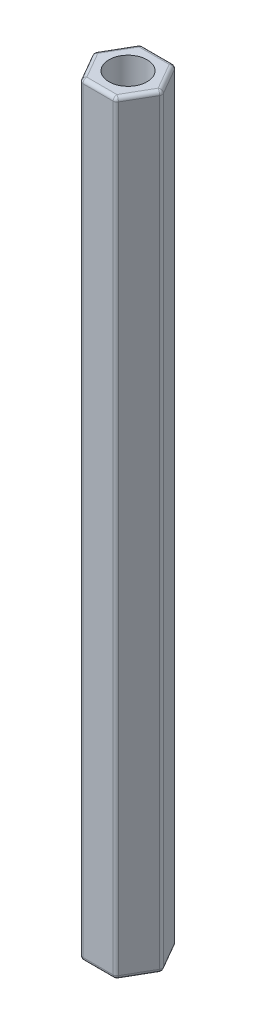
ISO-10303-21;
HEADER;
FILE_DESCRIPTION(('STEP AP214'),'2;1');
FILE_NAME('part.step','',(''),(''),'','','');
FILE_SCHEMA(('AUTOMOTIVE_DESIGN { 1 0 10303 214 1 1 1 1 }'));
ENDSEC;
DATA;
#1=APPLICATION_CONTEXT('core data for automotive mechanical design processes');
#2=APPLICATION_PROTOCOL_DEFINITION('international standard','automotive_design',2000,#1);
#3=PRODUCT_CONTEXT('',#1,'mechanical');
#4=PRODUCT('Part','Part','',(#3));
#5=PRODUCT_RELATED_PRODUCT_CATEGORY('part','',(#4));
#6=PRODUCT_DEFINITION_FORMATION('','',#4);
#7=PRODUCT_DEFINITION_CONTEXT('part definition',#1,'design');
#8=PRODUCT_DEFINITION('design','',#6,#7);
#9=PRODUCT_DEFINITION_SHAPE('','',#8);
#10=(LENGTH_UNIT() NAMED_UNIT(*) SI_UNIT(.MILLI.,.METRE.));
#11=(NAMED_UNIT(*) PLANE_ANGLE_UNIT() SI_UNIT($,.RADIAN.));
#12=(NAMED_UNIT(*) SI_UNIT($,.STERADIAN.) SOLID_ANGLE_UNIT());
#13=UNCERTAINTY_MEASURE_WITH_UNIT(LENGTH_MEASURE(1.E-05),#10,'distance_accuracy_value','');
#14=(GEOMETRIC_REPRESENTATION_CONTEXT(3) GLOBAL_UNCERTAINTY_ASSIGNED_CONTEXT((#13)) GLOBAL_UNIT_ASSIGNED_CONTEXT((#10,
#11,#12)) REPRESENTATION_CONTEXT('',''));
#15=CARTESIAN_POINT('',(0.,0.,0.));
#16=DIRECTION('',(0.,0.,1.));
#17=DIRECTION('',(1.,0.,0.));
#18=AXIS2_PLACEMENT_3D('',#15,#16,#17);
#19=CARTESIAN_POINT('',(0.,60.,0.));
#20=DIRECTION('',(0.,1.,0.));
#21=DIRECTION('',(0.,0.,1.));
#22=AXIS2_PLACEMENT_3D('',#19,#20,#21);
#23=PLANE('',#22);
#24=DIRECTION('',(0.500000000000007,0.,0.866025403784435));
#25=VECTOR('',#24,1.);
#26=CARTESIAN_POINT('',(-1.09696551146027,60.,2.20000000000001));
#27=LINE('',#26,#25);
#28=CARTESIAN_POINT('',(-2.36713610367747,60.,0.));
#29=VERTEX_POINT('',#28);
#30=CARTESIAN_POINT('',(-1.18356805183872,60.,2.05000000000001));
#31=VERTEX_POINT('',#30);
#32=EDGE_CURVE('E254',#29,#31,#27,.T.);
#33=ORIENTED_EDGE('',*,*,#32,.T.);
#34=DIRECTION('',(1.,0.,0.));
#35=VECTOR('',#34,1.);
#36=CARTESIAN_POINT('',(1.35677313259565,60.,2.04999999999999));
#37=LINE('',#36,#35);
#38=CARTESIAN_POINT('',(1.18356805183876,60.,2.04999999999999));
#39=VERTEX_POINT('',#38);
#40=EDGE_CURVE('E256',#31,#39,#37,.T.);
#41=ORIENTED_EDGE('',*,*,#40,.T.);
#42=DIRECTION('',(0.499999999999995,0.,-0.866025403784442));
#43=VECTOR('',#42,1.);
#44=CARTESIAN_POINT('',(2.45373864405591,60.,-0.149999999999999));
#45=LINE('',#44,#43);
#46=CARTESIAN_POINT('',(2.36713610367747,60.,0.));
#47=VERTEX_POINT('',#46);
#48=EDGE_CURVE('E246',#39,#47,#45,.T.);
#49=ORIENTED_EDGE('',*,*,#48,.T.);
#50=DIRECTION('',(-0.500000000000001,0.,-0.866025403784438));
#51=VECTOR('',#50,1.);
#52=CARTESIAN_POINT('',(1.09696551146028,60.,-2.20000000000001));
#53=LINE('',#52,#51);
#54=CARTESIAN_POINT('',(1.18356805183873,60.,-2.05000000000001));
#55=VERTEX_POINT('',#54);
#56=EDGE_CURVE('E248',#47,#55,#53,.T.);
#57=ORIENTED_EDGE('',*,*,#56,.T.);
#58=DIRECTION('',(-1.,0.,0.));
#59=VECTOR('',#58,1.);
#60=CARTESIAN_POINT('',(-1.35677313259563,60.,-2.05));
#61=LINE('',#60,#59);
#62=CARTESIAN_POINT('',(-1.18356805183874,60.,-2.05));
#63=VERTEX_POINT('',#62);
#64=EDGE_CURVE('E250',#55,#63,#61,.T.);
#65=ORIENTED_EDGE('',*,*,#64,.T.);
#66=DIRECTION('',(-0.499999999999995,0.,0.866025403784442));
#67=VECTOR('',#66,1.);
#68=CARTESIAN_POINT('',(-2.45373864405591,60.,0.150000000000018));
#69=LINE('',#68,#67);
#70=EDGE_CURVE('E252',#63,#29,#69,.T.);
#71=ORIENTED_EDGE('',*,*,#70,.T.);
#72=EDGE_LOOP('',(#33,#41,#49,#57,#65,#71));
#73=FACE_BOUND('',#72,.T.);
#74=CARTESIAN_POINT('',(0.,60.,0.));
#75=DIRECTION('',(0.,1.,0.));
#76=DIRECTION('',(0.,0.,1.));
#77=AXIS2_PLACEMENT_3D('',#74,#75,#76);
#78=CIRCLE('',#77,1.5);
#79=CARTESIAN_POINT('',(0.,60.,1.5));
#80=VERTEX_POINT('',#79);
#81=EDGE_CURVE('E193',#80,#80,#78,.T.);
#82=ORIENTED_EDGE('',*,*,#81,.F.);
#83=EDGE_LOOP('',(#82));
#84=FACE_BOUND('',#83,.T.);
#85=ADVANCED_FACE('F36',(#73,#84),#23,.T.);
#86=CARTESIAN_POINT('',(0.,0.,0.));
#87=DIRECTION('',(0.,1.,0.));
#88=DIRECTION('',(0.,0.,1.));
#89=AXIS2_PLACEMENT_3D('',#86,#87,#88);
#90=PLANE('',#89);
#91=DIRECTION('',(0.499999999999995,0.,-0.866025403784442));
#92=VECTOR('',#91,1.);
#93=CARTESIAN_POINT('',(1.77535207775811,0.,1.02499999999999));
#94=LINE('',#93,#92);
#95=CARTESIAN_POINT('',(2.36713610367747,0.,0.));
#96=VERTEX_POINT('',#95);
#97=CARTESIAN_POINT('',(1.18356805183876,0.,2.04999999999999));
#98=VERTEX_POINT('',#97);
#99=EDGE_CURVE('E259',#96,#98,#94,.F.);
#100=ORIENTED_EDGE('',*,*,#99,.T.);
#101=DIRECTION('',(1.,0.,0.));
#102=VECTOR('',#101,1.);
#103=CARTESIAN_POINT('',(0.,0.,2.05));
#104=LINE('',#103,#102);
#105=CARTESIAN_POINT('',(-1.18356805183872,0.,2.05000000000001));
#106=VERTEX_POINT('',#105);
#107=EDGE_CURVE('E11',#98,#106,#104,.F.);
#108=ORIENTED_EDGE('',*,*,#107,.T.);
#109=DIRECTION('',(0.500000000000007,0.,0.866025403784435));
#110=VECTOR('',#109,1.);
#111=CARTESIAN_POINT('',(-1.77535207775809,0.,1.02500000000001));
#112=LINE('',#111,#110);
#113=CARTESIAN_POINT('',(-2.36713610367747,0.,0.));
#114=VERTEX_POINT('',#113);
#115=EDGE_CURVE('E45',#106,#114,#112,.F.);
#116=ORIENTED_EDGE('',*,*,#115,.T.);
#117=DIRECTION('',(-0.499999999999995,0.,0.866025403784442));
#118=VECTOR('',#117,1.);
#119=CARTESIAN_POINT('',(-1.77535207775811,0.,-1.02499999999999));
#120=LINE('',#119,#118);
#121=CARTESIAN_POINT('',(-1.18356805183874,0.,-2.05));
#122=VERTEX_POINT('',#121);
#123=EDGE_CURVE('E265',#114,#122,#120,.F.);
#124=ORIENTED_EDGE('',*,*,#123,.T.);
#125=DIRECTION('',(-1.,0.,0.));
#126=VECTOR('',#125,1.);
#127=CARTESIAN_POINT('',(0.,0.,-2.05));
#128=LINE('',#127,#126);
#129=CARTESIAN_POINT('',(1.18356805183873,0.,-2.05000000000001));
#130=VERTEX_POINT('',#129);
#131=EDGE_CURVE('E263',#122,#130,#128,.F.);
#132=ORIENTED_EDGE('',*,*,#131,.T.);
#133=DIRECTION('',(-0.500000000000001,0.,-0.866025403784438));
#134=VECTOR('',#133,1.);
#135=CARTESIAN_POINT('',(1.7753520777581,0.,-1.025));
#136=LINE('',#135,#134);
#137=EDGE_CURVE('E261',#130,#96,#136,.F.);
#138=ORIENTED_EDGE('',*,*,#137,.T.);
#139=EDGE_LOOP('',(#100,#108,#116,#124,#132,#138));
#140=FACE_BOUND('',#139,.T.);
#141=CARTESIAN_POINT('',(0.,0.,0.));
#142=DIRECTION('',(0.,1.,0.));
#143=DIRECTION('',(0.,0.,1.));
#144=AXIS2_PLACEMENT_3D('',#141,#142,#143);
#145=CIRCLE('',#144,1.5);
#146=CARTESIAN_POINT('',(0.,0.,1.5));
#147=VERTEX_POINT('',#146);
#148=EDGE_CURVE('E357',#147,#147,#145,.T.);
#149=ORIENTED_EDGE('',*,*,#148,.T.);
#150=EDGE_LOOP('',(#149));
#151=FACE_BOUND('',#150,.T.);
#152=ADVANCED_FACE('F374',(#140,#151),#90,.F.);
#153=CARTESIAN_POINT('',(1.35677313259565,60.,2.34999999999999));
#154=DIRECTION('',(-0.866025403784441,0.,-0.499999999999995));
#155=DIRECTION('',(-0.499999999999995,0.,0.866025403784442));
#156=AXIS2_PLACEMENT_3D('',#153,#154,#155);
#157=PLANE('',#156);
#158=DIRECTION('',(0.,-1.,0.));
#159=VECTOR('',#158,1.);
#160=CARTESIAN_POINT('',(2.6269437248128,60.,0.15));
#161=LINE('',#160,#159);
#162=CARTESIAN_POINT('',(2.6269437248128,0.300000000000002,0.15));
#163=VERTEX_POINT('',#162);
#164=CARTESIAN_POINT('',(2.6269437248128,59.7,0.15));
#165=VERTEX_POINT('',#164);
#166=EDGE_CURVE('E170',#163,#165,#161,.F.);
#167=ORIENTED_EDGE('',*,*,#166,.T.);
#168=DIRECTION('',(0.499999999999995,0.,-0.866025403784442));
#169=VECTOR('',#168,1.);
#170=CARTESIAN_POINT('',(1.35677313259565,59.7,2.34999999999999));
#171=LINE('',#170,#169);
#172=CARTESIAN_POINT('',(1.44337567297409,59.7,2.19999999999999));
#173=VERTEX_POINT('',#172);
#174=EDGE_CURVE('E208',#165,#173,#171,.F.);
#175=ORIENTED_EDGE('',*,*,#174,.T.);
#176=DIRECTION('',(0.,-1.,0.));
#177=VECTOR('',#176,1.);
#178=CARTESIAN_POINT('',(1.44337567297409,60.,2.19999999999999));
#179=LINE('',#178,#177);
#180=CARTESIAN_POINT('',(1.44337567297409,0.300000000000002,2.19999999999999));
#181=VERTEX_POINT('',#180);
#182=EDGE_CURVE('E205',#173,#181,#179,.T.);
#183=ORIENTED_EDGE('',*,*,#182,.T.);
#184=DIRECTION('',(0.499999999999995,0.,-0.866025403784442));
#185=VECTOR('',#184,1.);
#186=CARTESIAN_POINT('',(1.35677313259565,0.300000000000002,2.34999999999999));
#187=LINE('',#186,#185);
#188=EDGE_CURVE('E200',#181,#163,#187,.T.);
#189=ORIENTED_EDGE('',*,*,#188,.T.);
#190=EDGE_LOOP('',(#167,#175,#183,#189));
#191=FACE_BOUND('',#190,.T.);
#192=ADVANCED_FACE('F380',(#191),#157,.F.);
#193=CARTESIAN_POINT('',(2.71354626519124,60.,0.));
#194=DIRECTION('',(-0.866025403784438,0.,0.500000000000001));
#195=DIRECTION('',(0.500000000000001,0.,0.866025403784438));
#196=AXIS2_PLACEMENT_3D('',#193,#194,#195);
#197=PLANE('',#196);
#198=DIRECTION('',(0.,-1.,0.));
#199=VECTOR('',#198,1.);
#200=CARTESIAN_POINT('',(1.44337567297406,60.,-2.20000000000001));
#201=LINE('',#200,#199);
#202=CARTESIAN_POINT('',(1.44337567297406,0.300000000000002,-2.20000000000001));
#203=VERTEX_POINT('',#202);
#204=CARTESIAN_POINT('',(1.44337567297406,59.7,-2.20000000000001));
#205=VERTEX_POINT('',#204);
#206=EDGE_CURVE('E192',#203,#205,#201,.F.);
#207=ORIENTED_EDGE('',*,*,#206,.T.);
#208=DIRECTION('',(-0.500000000000001,0.,-0.866025403784438));
#209=VECTOR('',#208,1.);
#210=CARTESIAN_POINT('',(2.71354626519124,59.7,0.));
#211=LINE('',#210,#209);
#212=CARTESIAN_POINT('',(2.6269437248128,59.7,-0.149999999999999));
#213=VERTEX_POINT('',#212);
#214=EDGE_CURVE('E197',#205,#213,#211,.F.);
#215=ORIENTED_EDGE('',*,*,#214,.T.);
#216=DIRECTION('',(0.,-1.,0.));
#217=VECTOR('',#216,1.);
#218=CARTESIAN_POINT('',(2.6269437248128,60.,-0.149999999999999));
#219=LINE('',#218,#217);
#220=CARTESIAN_POINT('',(2.6269437248128,0.300000000000002,-0.149999999999999));
#221=VERTEX_POINT('',#220);
#222=EDGE_CURVE('E168',#213,#221,#219,.T.);
#223=ORIENTED_EDGE('',*,*,#222,.T.);
#224=DIRECTION('',(-0.500000000000001,0.,-0.866025403784438));
#225=VECTOR('',#224,1.);
#226=CARTESIAN_POINT('',(2.71354626519124,0.300000000000002,0.));
#227=LINE('',#226,#225);
#228=EDGE_CURVE('E186',#221,#203,#227,.T.);
#229=ORIENTED_EDGE('',*,*,#228,.T.);
#230=EDGE_LOOP('',(#207,#215,#223,#229));
#231=FACE_BOUND('',#230,.T.);
#232=ADVANCED_FACE('F195',(#231),#197,.F.);
#233=CARTESIAN_POINT('',(1.35677313259562,60.,-2.35000000000001));
#234=DIRECTION('',(0.,0.,1.));
#235=DIRECTION('',(1.,0.,0.));
#236=AXIS2_PLACEMENT_3D('',#233,#234,#235);
#237=PLANE('',#236);
#238=DIRECTION('',(0.,-1.,0.));
#239=VECTOR('',#238,1.);
#240=CARTESIAN_POINT('',(-1.18356805183874,60.,-2.35));
#241=LINE('',#240,#239);
#242=CARTESIAN_POINT('',(-1.18356805183874,0.300000000000002,-2.35));
#243=VERTEX_POINT('',#242);
#244=CARTESIAN_POINT('',(-1.18356805183874,59.7,-2.35));
#245=VERTEX_POINT('',#244);
#246=EDGE_CURVE('E212',#243,#245,#241,.F.);
#247=ORIENTED_EDGE('',*,*,#246,.T.);
#248=DIRECTION('',(-1.,0.,0.));
#249=VECTOR('',#248,1.);
#250=CARTESIAN_POINT('',(1.35677313259562,59.7,-2.35000000000001));
#251=LINE('',#250,#249);
#252=CARTESIAN_POINT('',(1.18356805183873,59.7,-2.35));
#253=VERTEX_POINT('',#252);
#254=EDGE_CURVE('E217',#245,#253,#251,.F.);
#255=ORIENTED_EDGE('',*,*,#254,.T.);
#256=DIRECTION('',(0.,-1.,0.));
#257=VECTOR('',#256,1.);
#258=CARTESIAN_POINT('',(1.18356805183873,60.,-2.35));
#259=LINE('',#258,#257);
#260=CARTESIAN_POINT('',(1.18356805183873,0.300000000000002,-2.35));
#261=VERTEX_POINT('',#260);
#262=EDGE_CURVE('E214',#253,#261,#259,.T.);
#263=ORIENTED_EDGE('',*,*,#262,.T.);
#264=DIRECTION('',(-1.,0.,0.));
#265=VECTOR('',#264,1.);
#266=CARTESIAN_POINT('',(1.35677313259562,0.300000000000002,-2.35000000000001));
#267=LINE('',#266,#265);
#268=EDGE_CURVE('E210',#261,#243,#267,.T.);
#269=ORIENTED_EDGE('',*,*,#268,.T.);
#270=EDGE_LOOP('',(#247,#255,#263,#269));
#271=FACE_BOUND('',#270,.T.);
#272=ADVANCED_FACE('F395',(#271),#237,.F.);
#273=CARTESIAN_POINT('',(-1.35677313259563,60.,-2.35));
#274=DIRECTION('',(0.866025403784441,0.,0.499999999999995));
#275=DIRECTION('',(0.499999999999995,0.,-0.866025403784442));
#276=AXIS2_PLACEMENT_3D('',#273,#274,#275);
#277=PLANE('',#276);
#278=DIRECTION('',(0.,-1.,0.));
#279=VECTOR('',#278,1.);
#280=CARTESIAN_POINT('',(-2.6269437248128,60.,-0.149999999999982));
#281=LINE('',#280,#279);
#282=CARTESIAN_POINT('',(-2.6269437248128,0.300000000000002,-0.149999999999982));
#283=VERTEX_POINT('',#282);
#284=CARTESIAN_POINT('',(-2.6269437248128,59.7,-0.149999999999982));
#285=VERTEX_POINT('',#284);
#286=EDGE_CURVE('E221',#283,#285,#281,.F.);
#287=ORIENTED_EDGE('',*,*,#286,.T.);
#288=DIRECTION('',(-0.499999999999995,0.,0.866025403784442));
#289=VECTOR('',#288,1.);
#290=CARTESIAN_POINT('',(-1.35677313259563,59.7,-2.35));
#291=LINE('',#290,#289);
#292=CARTESIAN_POINT('',(-1.44337567297408,59.7,-2.19999999999999));
#293=VERTEX_POINT('',#292);
#294=EDGE_CURVE('E226',#285,#293,#291,.F.);
#295=ORIENTED_EDGE('',*,*,#294,.T.);
#296=DIRECTION('',(0.,-1.,0.));
#297=VECTOR('',#296,1.);
#298=CARTESIAN_POINT('',(-1.44337567297408,60.,-2.19999999999999));
#299=LINE('',#298,#297);
#300=CARTESIAN_POINT('',(-1.44337567297408,0.300000000000002,-2.19999999999999));
#301=VERTEX_POINT('',#300);
#302=EDGE_CURVE('E223',#293,#301,#299,.T.);
#303=ORIENTED_EDGE('',*,*,#302,.T.);
#304=DIRECTION('',(-0.499999999999995,0.,0.866025403784442));
#305=VECTOR('',#304,1.);
#306=CARTESIAN_POINT('',(-1.35677313259563,0.300000000000002,-2.35));
#307=LINE('',#306,#305);
#308=EDGE_CURVE('E219',#301,#283,#307,.T.);
#309=ORIENTED_EDGE('',*,*,#308,.T.);
#310=EDGE_LOOP('',(#287,#295,#303,#309));
#311=FACE_BOUND('',#310,.T.);
#312=ADVANCED_FACE('F391',(#311),#277,.F.);
#313=CARTESIAN_POINT('',(-2.71354626519124,60.,0.));
#314=DIRECTION('',(0.866025403784434,0.,-0.500000000000007));
#315=DIRECTION('',(-0.500000000000007,0.,-0.866025403784435));
#316=AXIS2_PLACEMENT_3D('',#313,#314,#315);
#317=PLANE('',#316);
#318=DIRECTION('',(0.,-1.,0.));
#319=VECTOR('',#318,1.);
#320=CARTESIAN_POINT('',(-1.44337567297405,60.,2.20000000000001));
#321=LINE('',#320,#319);
#322=CARTESIAN_POINT('',(-1.44337567297405,0.300000000000002,2.20000000000001));
#323=VERTEX_POINT('',#322);
#324=CARTESIAN_POINT('',(-1.44337567297405,59.7,2.20000000000001));
#325=VERTEX_POINT('',#324);
#326=EDGE_CURVE('E230',#323,#325,#321,.F.);
#327=ORIENTED_EDGE('',*,*,#326,.T.);
#328=DIRECTION('',(0.500000000000007,0.,0.866025403784435));
#329=VECTOR('',#328,1.);
#330=CARTESIAN_POINT('',(-2.71354626519124,59.7,0.));
#331=LINE('',#330,#329);
#332=CARTESIAN_POINT('',(-2.6269437248128,59.7,0.150000000000019));
#333=VERTEX_POINT('',#332);
#334=EDGE_CURVE('E235',#325,#333,#331,.F.);
#335=ORIENTED_EDGE('',*,*,#334,.T.);
#336=DIRECTION('',(0.,-1.,0.));
#337=VECTOR('',#336,1.);
#338=CARTESIAN_POINT('',(-2.6269437248128,60.,0.150000000000019));
#339=LINE('',#338,#337);
#340=CARTESIAN_POINT('',(-2.6269437248128,0.300000000000002,0.150000000000019));
#341=VERTEX_POINT('',#340);
#342=EDGE_CURVE('E232',#333,#341,#339,.T.);
#343=ORIENTED_EDGE('',*,*,#342,.T.);
#344=DIRECTION('',(0.500000000000007,0.,0.866025403784435));
#345=VECTOR('',#344,1.);
#346=CARTESIAN_POINT('',(-2.71354626519124,0.300000000000002,0.));
#347=LINE('',#346,#345);
#348=EDGE_CURVE('E228',#341,#323,#347,.T.);
#349=ORIENTED_EDGE('',*,*,#348,.T.);
#350=EDGE_LOOP('',(#327,#335,#343,#349));
#351=FACE_BOUND('',#350,.T.);
#352=ADVANCED_FACE('F387',(#351),#317,.F.);
#353=CARTESIAN_POINT('',(-1.3567731325956,60.,2.35000000000001));
#354=DIRECTION('',(0.,0.,-1.));
#355=DIRECTION('',(-1.,0.,0.));
#356=AXIS2_PLACEMENT_3D('',#353,#354,#355);
#357=PLANE('',#356);
#358=DIRECTION('',(0.,-1.,0.));
#359=VECTOR('',#358,1.);
#360=CARTESIAN_POINT('',(1.18356805183876,60.,2.34999999999999));
#361=LINE('',#360,#359);
#362=CARTESIAN_POINT('',(1.18356805183876,0.300000000000002,2.34999999999999));
#363=VERTEX_POINT('',#362);
#364=CARTESIAN_POINT('',(1.18356805183876,59.7,2.34999999999999));
#365=VERTEX_POINT('',#364);
#366=EDGE_CURVE('E239',#363,#365,#361,.F.);
#367=ORIENTED_EDGE('',*,*,#366,.T.);
#368=DIRECTION('',(1.,0.,0.));
#369=VECTOR('',#368,1.);
#370=CARTESIAN_POINT('',(-1.3567731325956,59.7,2.35000000000001));
#371=LINE('',#370,#369);
#372=CARTESIAN_POINT('',(-1.18356805183871,59.7,2.35000000000001));
#373=VERTEX_POINT('',#372);
#374=EDGE_CURVE('E244',#365,#373,#371,.F.);
#375=ORIENTED_EDGE('',*,*,#374,.T.);
#376=DIRECTION('',(0.,-1.,0.));
#377=VECTOR('',#376,1.);
#378=CARTESIAN_POINT('',(-1.18356805183871,60.,2.35000000000001));
#379=LINE('',#378,#377);
#380=CARTESIAN_POINT('',(-1.18356805183871,0.300000000000002,2.35000000000001));
#381=VERTEX_POINT('',#380);
#382=EDGE_CURVE('E241',#373,#381,#379,.T.);
#383=ORIENTED_EDGE('',*,*,#382,.T.);
#384=DIRECTION('',(1.,0.,0.));
#385=VECTOR('',#384,1.);
#386=CARTESIAN_POINT('',(-1.3567731325956,0.300000000000002,2.35000000000001));
#387=LINE('',#386,#385);
#388=EDGE_CURVE('E237',#381,#363,#387,.T.);
#389=ORIENTED_EDGE('',*,*,#388,.T.);
#390=EDGE_LOOP('',(#367,#375,#383,#389));
#391=FACE_BOUND('',#390,.T.);
#392=ADVANCED_FACE('F384',(#391),#357,.F.);
#393=CARTESIAN_POINT('',(0.,60.,0.));
#394=DIRECTION('',(0.,-1.,0.));
#395=DIRECTION('',(0.,0.,-1.));
#396=AXIS2_PLACEMENT_3D('',#393,#394,#395);
#397=CYLINDRICAL_SURFACE('',#396,1.5);
#398=ORIENTED_EDGE('',*,*,#81,.T.);
#399=EDGE_LOOP('',(#398));
#400=FACE_BOUND('',#399,.T.);
#401=ORIENTED_EDGE('',*,*,#148,.F.);
#402=EDGE_LOOP('',(#401));
#403=FACE_BOUND('',#402,.T.);
#404=ADVANCED_FACE('F370',(#400,#403),#397,.F.);
#405=CARTESIAN_POINT('',(-2.36713610367747,60.,0.));
#406=DIRECTION('',(0.,-1.,0.));
#407=DIRECTION('',(0.,0.,-1.));
#408=AXIS2_PLACEMENT_3D('',#405,#406,#407);
#409=CYLINDRICAL_SURFACE('',#408,0.3);
#410=CARTESIAN_POINT('',(-2.36713610367747,59.7,0.));
#411=DIRECTION('',(0.,1.,0.));
#412=DIRECTION('',(0.,0.,1.));
#413=AXIS2_PLACEMENT_3D('',#410,#411,#412);
#414=CIRCLE('',#413,0.3);
#415=EDGE_CURVE('E40',#285,#333,#414,.T.);
#416=ORIENTED_EDGE('',*,*,#415,.F.);
#417=ORIENTED_EDGE('',*,*,#286,.F.);
#418=CARTESIAN_POINT('',(-2.36713610367747,0.300000000000002,0.));
#419=DIRECTION('',(0.,-1.,0.));
#420=DIRECTION('',(0.,0.,-1.));
#421=AXIS2_PLACEMENT_3D('',#418,#419,#420);
#422=CIRCLE('',#421,0.3);
#423=EDGE_CURVE('E350',#341,#283,#422,.T.);
#424=ORIENTED_EDGE('',*,*,#423,.F.);
#425=ORIENTED_EDGE('',*,*,#342,.F.);
#426=EDGE_LOOP('',(#416,#417,#424,#425));
#427=FACE_BOUND('',#426,.T.);
#428=ADVANCED_FACE('F38',(#427),#409,.T.);
#429=CARTESIAN_POINT('',(-2.36713610367747,59.7,0.));
#430=DIRECTION('',(0.,0.,1.));
#431=DIRECTION('',(1.,0.,0.));
#432=AXIS2_PLACEMENT_3D('',#429,#430,#431);
#433=SPHERICAL_SURFACE('',#432,0.3);
#434=CARTESIAN_POINT('',(-2.36713610367747,59.7,0.));
#435=DIRECTION('',(-0.499999999999997,0.,0.866025403784441));
#436=DIRECTION('',(0.866025403784441,0.,0.499999999999997));
#437=AXIS2_PLACEMENT_3D('',#434,#435,#436);
#438=CIRCLE('',#437,0.3);
#439=EDGE_CURVE('E345',#285,#29,#438,.F.);
#440=ORIENTED_EDGE('',*,*,#439,.F.);
#441=ORIENTED_EDGE('',*,*,#415,.T.);
#442=CARTESIAN_POINT('',(-2.36713610367747,59.7,0.));
#443=DIRECTION('',(-0.500000000000007,0.,-0.866025403784435));
#444=DIRECTION('',(-0.866025403784435,0.,0.500000000000007));
#445=AXIS2_PLACEMENT_3D('',#442,#443,#444);
#446=CIRCLE('',#445,0.3);
#447=EDGE_CURVE('E348',#29,#333,#446,.F.);
#448=ORIENTED_EDGE('',*,*,#447,.F.);
#449=EDGE_LOOP('',(#440,#441,#448));
#450=FACE_BOUND('',#449,.T.);
#451=ADVANCED_FACE('F508',(#450),#433,.T.);
#452=CARTESIAN_POINT('',(-2.36713610367747,0.3,0.));
#453=DIRECTION('',(0.,0.,1.));
#454=DIRECTION('',(1.,0.,0.));
#455=AXIS2_PLACEMENT_3D('',#452,#453,#454);
#456=SPHERICAL_SURFACE('',#455,0.3);
#457=CARTESIAN_POINT('',(-2.36713610367747,0.3,0.));
#458=DIRECTION('',(-0.500000000000007,0.,-0.866025403784435));
#459=DIRECTION('',(-0.866025403784435,0.,0.500000000000007));
#460=AXIS2_PLACEMENT_3D('',#457,#458,#459);
#461=CIRCLE('',#460,0.3);
#462=EDGE_CURVE('E340',#341,#114,#461,.F.);
#463=ORIENTED_EDGE('',*,*,#462,.F.);
#464=ORIENTED_EDGE('',*,*,#423,.T.);
#465=CARTESIAN_POINT('',(-2.36713610367747,0.300000000000002,0.));
#466=DIRECTION('',(-0.499999999999995,0.,0.866025403784442));
#467=DIRECTION('',(0.866025403784442,0.,0.499999999999995));
#468=AXIS2_PLACEMENT_3D('',#465,#466,#467);
#469=CIRCLE('',#468,0.3);
#470=EDGE_CURVE('E342',#114,#283,#469,.F.);
#471=ORIENTED_EDGE('',*,*,#470,.F.);
#472=EDGE_LOOP('',(#463,#464,#471));
#473=FACE_BOUND('',#472,.T.);
#474=ADVANCED_FACE('F505',(#473),#456,.T.);
#475=CARTESIAN_POINT('',(-1.77535207775809,59.7,1.02500000000001));
#476=DIRECTION('',(-0.500000000000007,0.,-0.866025403784435));
#477=DIRECTION('',(-0.866025403784434,0.,0.500000000000007));
#478=AXIS2_PLACEMENT_3D('',#475,#476,#477);
#479=CYLINDRICAL_SURFACE('',#478,0.3);
#480=ORIENTED_EDGE('',*,*,#447,.T.);
#481=ORIENTED_EDGE('',*,*,#334,.F.);
#482=CARTESIAN_POINT('',(-1.18356805183872,59.7,2.05000000000001));
#483=DIRECTION('',(0.500000000000008,0.,0.866025403784434));
#484=DIRECTION('',(0.866025403784434,0.,-0.500000000000008));
#485=AXIS2_PLACEMENT_3D('',#482,#483,#484);
#486=CIRCLE('',#485,0.3);
#487=EDGE_CURVE('E334',#31,#325,#486,.T.);
#488=ORIENTED_EDGE('',*,*,#487,.F.);
#489=ORIENTED_EDGE('',*,*,#32,.F.);
#490=EDGE_LOOP('',(#480,#481,#488,#489));
#491=FACE_BOUND('',#490,.T.);
#492=ADVANCED_FACE('F501',(#491),#479,.T.);
#493=CARTESIAN_POINT('',(-1.77535207775811,59.7,-1.02499999999999));
#494=DIRECTION('',(0.499999999999995,0.,-0.866025403784442));
#495=DIRECTION('',(-0.866025403784441,0.,-0.499999999999995));
#496=AXIS2_PLACEMENT_3D('',#493,#494,#495);
#497=CYLINDRICAL_SURFACE('',#496,0.3);
#498=ORIENTED_EDGE('',*,*,#439,.T.);
#499=ORIENTED_EDGE('',*,*,#70,.F.);
#500=CARTESIAN_POINT('',(-1.18356805183874,59.7,-2.05));
#501=DIRECTION('',(0.499999999999996,0.,-0.866025403784441));
#502=DIRECTION('',(-0.866025403784441,0.,-0.499999999999996));
#503=AXIS2_PLACEMENT_3D('',#500,#501,#502);
#504=CIRCLE('',#503,0.3);
#505=EDGE_CURVE('E331',#293,#63,#504,.T.);
#506=ORIENTED_EDGE('',*,*,#505,.F.);
#507=ORIENTED_EDGE('',*,*,#294,.F.);
#508=EDGE_LOOP('',(#498,#499,#506,#507));
#509=FACE_BOUND('',#508,.T.);
#510=ADVANCED_FACE('F497',(#509),#497,.T.);
#511=CARTESIAN_POINT('',(-1.18356805183874,60.,-2.05));
#512=DIRECTION('',(0.,-1.,0.));
#513=DIRECTION('',(0.,0.,-1.));
#514=AXIS2_PLACEMENT_3D('',#511,#512,#513);
#515=CYLINDRICAL_SURFACE('',#514,0.3);
#516=CARTESIAN_POINT('',(-1.18356805183874,0.300000000000002,-2.05));
#517=DIRECTION('',(0.,-1.,0.));
#518=DIRECTION('',(0.,0.,-1.));
#519=AXIS2_PLACEMENT_3D('',#516,#517,#518);
#520=CIRCLE('',#519,0.3);
#521=EDGE_CURVE('E325',#301,#243,#520,.T.);
#522=ORIENTED_EDGE('',*,*,#521,.F.);
#523=ORIENTED_EDGE('',*,*,#302,.F.);
#524=CARTESIAN_POINT('',(-1.18356805183874,59.7,-2.05));
#525=DIRECTION('',(0.,1.,0.));
#526=DIRECTION('',(0.,0.,1.));
#527=AXIS2_PLACEMENT_3D('',#524,#525,#526);
#528=CIRCLE('',#527,0.3);
#529=EDGE_CURVE('E328',#245,#293,#528,.T.);
#530=ORIENTED_EDGE('',*,*,#529,.F.);
#531=ORIENTED_EDGE('',*,*,#246,.F.);
#532=EDGE_LOOP('',(#522,#523,#530,#531));
#533=FACE_BOUND('',#532,.T.);
#534=ADVANCED_FACE('F493',(#533),#515,.T.);
#535=CARTESIAN_POINT('',(-1.0969655114603,0.300000000000002,-2.2));
#536=DIRECTION('',(-0.499999999999995,0.,0.866025403784442));
#537=DIRECTION('',(0.866025403784441,0.,0.499999999999995));
#538=AXIS2_PLACEMENT_3D('',#535,#536,#537);
#539=CYLINDRICAL_SURFACE('',#538,0.3);
#540=ORIENTED_EDGE('',*,*,#470,.T.);
#541=ORIENTED_EDGE('',*,*,#308,.F.);
#542=CARTESIAN_POINT('',(-1.18356805183874,0.3,-2.05));
#543=DIRECTION('',(0.499999999999995,0.,-0.866025403784441));
#544=DIRECTION('',(-0.866025403784441,0.,-0.499999999999995));
#545=AXIS2_PLACEMENT_3D('',#542,#543,#544);
#546=CIRCLE('',#545,0.3);
#547=EDGE_CURVE('E323',#122,#301,#546,.T.);
#548=ORIENTED_EDGE('',*,*,#547,.F.);
#549=ORIENTED_EDGE('',*,*,#123,.F.);
#550=EDGE_LOOP('',(#540,#541,#548,#549));
#551=FACE_BOUND('',#550,.T.);
#552=ADVANCED_FACE('F489',(#551),#539,.T.);
#553=CARTESIAN_POINT('',(-2.45373864405591,0.300000000000002,-0.149999999999983));
#554=DIRECTION('',(0.500000000000007,0.,0.866025403784435));
#555=DIRECTION('',(0.866025403784434,0.,-0.500000000000007));
#556=AXIS2_PLACEMENT_3D('',#553,#554,#555);
#557=CYLINDRICAL_SURFACE('',#556,0.3);
#558=ORIENTED_EDGE('',*,*,#462,.T.);
#559=ORIENTED_EDGE('',*,*,#115,.F.);
#560=CARTESIAN_POINT('',(-1.18356805183871,0.300000000000002,2.05000000000001));
#561=DIRECTION('',(0.500000000000007,0.,0.866025403784435));
#562=DIRECTION('',(0.866025403784435,0.,-0.500000000000007));
#563=AXIS2_PLACEMENT_3D('',#560,#561,#562);
#564=CIRCLE('',#563,0.3);
#565=EDGE_CURVE('E321',#323,#106,#564,.T.);
#566=ORIENTED_EDGE('',*,*,#565,.F.);
#567=ORIENTED_EDGE('',*,*,#348,.F.);
#568=EDGE_LOOP('',(#558,#559,#566,#567));
#569=FACE_BOUND('',#568,.T.);
#570=ADVANCED_FACE('F485',(#569),#557,.T.);
#571=CARTESIAN_POINT('',(-1.18356805183872,60.,2.05000000000001));
#572=DIRECTION('',(0.,-1.,0.));
#573=DIRECTION('',(0.,0.,-1.));
#574=AXIS2_PLACEMENT_3D('',#571,#572,#573);
#575=CYLINDRICAL_SURFACE('',#574,0.3);
#576=CARTESIAN_POINT('',(-1.18356805183871,59.7,2.05000000000001));
#577=DIRECTION('',(0.,1.,0.));
#578=DIRECTION('',(0.,0.,1.));
#579=AXIS2_PLACEMENT_3D('',#576,#577,#578);
#580=CIRCLE('',#579,0.3);
#581=EDGE_CURVE('E337',#325,#373,#580,.T.);
#582=ORIENTED_EDGE('',*,*,#581,.F.);
#583=ORIENTED_EDGE('',*,*,#326,.F.);
#584=CARTESIAN_POINT('',(-1.18356805183872,0.300000000000002,2.05000000000001));
#585=DIRECTION('',(0.,-1.,0.));
#586=DIRECTION('',(0.,0.,-1.));
#587=AXIS2_PLACEMENT_3D('',#584,#585,#586);
#588=CIRCLE('',#587,0.3);
#589=EDGE_CURVE('E318',#381,#323,#588,.T.);
#590=ORIENTED_EDGE('',*,*,#589,.F.);
#591=ORIENTED_EDGE('',*,*,#382,.F.);
#592=EDGE_LOOP('',(#582,#583,#590,#591));
#593=FACE_BOUND('',#592,.T.);
#594=ADVANCED_FACE('F481',(#593),#575,.T.);
#595=CARTESIAN_POINT('',(-1.18356805183872,59.7,2.05000000000001));
#596=DIRECTION('',(0.,0.,1.));
#597=DIRECTION('',(1.,0.,0.));
#598=AXIS2_PLACEMENT_3D('',#595,#596,#597);
#599=SPHERICAL_SURFACE('',#598,0.3);
#600=ORIENTED_EDGE('',*,*,#487,.T.);
#601=ORIENTED_EDGE('',*,*,#581,.T.);
#602=CARTESIAN_POINT('',(-1.18356805183872,59.7,2.05000000000001));
#603=DIRECTION('',(-1.,0.,0.));
#604=DIRECTION('',(0.,0.,1.));
#605=AXIS2_PLACEMENT_3D('',#602,#603,#604);
#606=CIRCLE('',#605,0.3);
#607=EDGE_CURVE('E315',#31,#373,#606,.F.);
#608=ORIENTED_EDGE('',*,*,#607,.F.);
#609=EDGE_LOOP('',(#600,#601,#608));
#610=FACE_BOUND('',#609,.T.);
#611=ADVANCED_FACE('F477',(#610),#599,.T.);
#612=CARTESIAN_POINT('',(-1.18356805183874,59.7,-2.05));
#613=DIRECTION('',(0.,0.,1.));
#614=DIRECTION('',(1.,0.,0.));
#615=AXIS2_PLACEMENT_3D('',#612,#613,#614);
#616=SPHERICAL_SURFACE('',#615,0.3);
#617=ORIENTED_EDGE('',*,*,#529,.T.);
#618=ORIENTED_EDGE('',*,*,#505,.T.);
#619=CARTESIAN_POINT('',(-1.18356805183874,59.7,-2.05));
#620=DIRECTION('',(-1.,0.,0.));
#621=DIRECTION('',(0.,0.,1.));
#622=AXIS2_PLACEMENT_3D('',#619,#620,#621);
#623=CIRCLE('',#622,0.3);
#624=EDGE_CURVE('E312',#245,#63,#623,.F.);
#625=ORIENTED_EDGE('',*,*,#624,.F.);
#626=EDGE_LOOP('',(#617,#618,#625));
#627=FACE_BOUND('',#626,.T.);
#628=ADVANCED_FACE('F473',(#627),#616,.T.);
#629=CARTESIAN_POINT('',(-1.18356805183874,0.3,-2.05));
#630=DIRECTION('',(0.,0.,1.));
#631=DIRECTION('',(1.,0.,0.));
#632=AXIS2_PLACEMENT_3D('',#629,#630,#631);
#633=SPHERICAL_SURFACE('',#632,0.3);
#634=ORIENTED_EDGE('',*,*,#547,.T.);
#635=ORIENTED_EDGE('',*,*,#521,.T.);
#636=CARTESIAN_POINT('',(-1.18356805183874,0.300000000000002,-2.05));
#637=DIRECTION('',(-1.,0.,0.));
#638=DIRECTION('',(0.,0.,1.));
#639=AXIS2_PLACEMENT_3D('',#636,#637,#638);
#640=CIRCLE('',#639,0.3);
#641=EDGE_CURVE('E309',#122,#243,#640,.F.);
#642=ORIENTED_EDGE('',*,*,#641,.F.);
#643=EDGE_LOOP('',(#634,#635,#642));
#644=FACE_BOUND('',#643,.T.);
#645=ADVANCED_FACE('F469',(#644),#633,.T.);
#646=CARTESIAN_POINT('',(-1.18356805183872,0.3,2.05000000000001));
#647=DIRECTION('',(0.,0.,1.));
#648=DIRECTION('',(1.,0.,0.));
#649=AXIS2_PLACEMENT_3D('',#646,#647,#648);
#650=SPHERICAL_SURFACE('',#649,0.3);
#651=ORIENTED_EDGE('',*,*,#589,.T.);
#652=ORIENTED_EDGE('',*,*,#565,.T.);
#653=CARTESIAN_POINT('',(-1.18356805183872,0.3,2.05000000000001));
#654=DIRECTION('',(-1.,0.,0.));
#655=DIRECTION('',(0.,0.,1.));
#656=AXIS2_PLACEMENT_3D('',#653,#654,#655);
#657=CIRCLE('',#656,0.3);
#658=EDGE_CURVE('E53',#381,#106,#657,.F.);
#659=ORIENTED_EDGE('',*,*,#658,.F.);
#660=EDGE_LOOP('',(#651,#652,#659));
#661=FACE_BOUND('',#660,.T.);
#662=ADVANCED_FACE('F465',(#661),#650,.T.);
#663=CARTESIAN_POINT('',(0.,59.7,2.05));
#664=DIRECTION('',(-1.,0.,0.));
#665=DIRECTION('',(0.,0.,1.));
#666=AXIS2_PLACEMENT_3D('',#663,#664,#665);
#667=CYLINDRICAL_SURFACE('',#666,0.3);
#668=ORIENTED_EDGE('',*,*,#607,.T.);
#669=ORIENTED_EDGE('',*,*,#374,.F.);
#670=CARTESIAN_POINT('',(1.18356805183876,59.7,2.04999999999999));
#671=DIRECTION('',(1.,0.,0.));
#672=DIRECTION('',(0.,0.,-1.));
#673=AXIS2_PLACEMENT_3D('',#670,#671,#672);
#674=CIRCLE('',#673,0.3);
#675=EDGE_CURVE('E302',#39,#365,#674,.T.);
#676=ORIENTED_EDGE('',*,*,#675,.F.);
#677=ORIENTED_EDGE('',*,*,#40,.F.);
#678=EDGE_LOOP('',(#668,#669,#676,#677));
#679=FACE_BOUND('',#678,.T.);
#680=ADVANCED_FACE('F461',(#679),#667,.T.);
#681=CARTESIAN_POINT('',(0.,59.7,-2.05));
#682=DIRECTION('',(1.,0.,0.));
#683=DIRECTION('',(0.,0.,-1.));
#684=AXIS2_PLACEMENT_3D('',#681,#682,#683);
#685=CYLINDRICAL_SURFACE('',#684,0.3);
#686=ORIENTED_EDGE('',*,*,#624,.T.);
#687=ORIENTED_EDGE('',*,*,#64,.F.);
#688=CARTESIAN_POINT('',(1.18356805183873,59.7,-2.05000000000001));
#689=DIRECTION('',(1.,0.,0.));
#690=DIRECTION('',(0.,0.,-1.));
#691=AXIS2_PLACEMENT_3D('',#688,#689,#690);
#692=CIRCLE('',#691,0.3);
#693=EDGE_CURVE('E299',#253,#55,#692,.T.);
#694=ORIENTED_EDGE('',*,*,#693,.F.);
#695=ORIENTED_EDGE('',*,*,#254,.F.);
#696=EDGE_LOOP('',(#686,#687,#694,#695));
#697=FACE_BOUND('',#696,.T.);
#698=ADVANCED_FACE('F457',(#697),#685,.T.);
#699=CARTESIAN_POINT('',(1.18356805183873,60.,-2.05000000000001));
#700=DIRECTION('',(0.,-1.,0.));
#701=DIRECTION('',(0.,0.,-1.));
#702=AXIS2_PLACEMENT_3D('',#699,#700,#701);
#703=CYLINDRICAL_SURFACE('',#702,0.3);
#704=CARTESIAN_POINT('',(1.18356805183873,0.300000000000002,-2.05000000000001));
#705=DIRECTION('',(0.,-1.,0.));
#706=DIRECTION('',(0.,0.,-1.));
#707=AXIS2_PLACEMENT_3D('',#704,#705,#706);
#708=CIRCLE('',#707,0.3);
#709=EDGE_CURVE('E293',#261,#203,#708,.T.);
#710=ORIENTED_EDGE('',*,*,#709,.F.);
#711=ORIENTED_EDGE('',*,*,#262,.F.);
#712=CARTESIAN_POINT('',(1.18356805183873,59.7,-2.05000000000001));
#713=DIRECTION('',(0.,1.,0.));
#714=DIRECTION('',(0.,0.,1.));
#715=AXIS2_PLACEMENT_3D('',#712,#713,#714);
#716=CIRCLE('',#715,0.3);
#717=EDGE_CURVE('E296',#205,#253,#716,.T.);
#718=ORIENTED_EDGE('',*,*,#717,.F.);
#719=ORIENTED_EDGE('',*,*,#206,.F.);
#720=EDGE_LOOP('',(#710,#711,#718,#719));
#721=FACE_BOUND('',#720,.T.);
#722=ADVANCED_FACE('F453',(#721),#703,.T.);
#723=CARTESIAN_POINT('',(1.35677313259562,0.300000000000002,-2.05000000000001));
#724=DIRECTION('',(-1.,0.,0.));
#725=DIRECTION('',(0.,0.,1.));
#726=AXIS2_PLACEMENT_3D('',#723,#724,#725);
#727=CYLINDRICAL_SURFACE('',#726,0.3);
#728=ORIENTED_EDGE('',*,*,#641,.T.);
#729=ORIENTED_EDGE('',*,*,#268,.F.);
#730=CARTESIAN_POINT('',(1.18356805183873,0.3,-2.05000000000001));
#731=DIRECTION('',(1.,0.,0.));
#732=DIRECTION('',(0.,0.,-1.));
#733=AXIS2_PLACEMENT_3D('',#730,#731,#732);
#734=CIRCLE('',#733,0.3);
#735=EDGE_CURVE('E291',#130,#261,#734,.T.);
#736=ORIENTED_EDGE('',*,*,#735,.F.);
#737=ORIENTED_EDGE('',*,*,#131,.F.);
#738=EDGE_LOOP('',(#728,#729,#736,#737));
#739=FACE_BOUND('',#738,.T.);
#740=ADVANCED_FACE('F450',(#739),#727,.T.);
#741=CARTESIAN_POINT('',(-1.3567731325956,0.300000000000002,2.05000000000001));
#742=DIRECTION('',(1.,0.,0.));
#743=DIRECTION('',(0.,0.,-1.));
#744=AXIS2_PLACEMENT_3D('',#741,#742,#743);
#745=CYLINDRICAL_SURFACE('',#744,0.3);
#746=ORIENTED_EDGE('',*,*,#658,.T.);
#747=ORIENTED_EDGE('',*,*,#107,.F.);
#748=CARTESIAN_POINT('',(1.18356805183876,0.300000000000002,2.04999999999999));
#749=DIRECTION('',(1.,0.,0.));
#750=DIRECTION('',(0.,0.,-1.));
#751=AXIS2_PLACEMENT_3D('',#748,#749,#750);
#752=CIRCLE('',#751,0.3);
#753=EDGE_CURVE('E288',#363,#98,#752,.T.);
#754=ORIENTED_EDGE('',*,*,#753,.F.);
#755=ORIENTED_EDGE('',*,*,#388,.F.);
#756=EDGE_LOOP('',(#746,#747,#754,#755));
#757=FACE_BOUND('',#756,.T.);
#758=ADVANCED_FACE('F446',(#757),#745,.T.);
#759=CARTESIAN_POINT('',(1.18356805183876,60.,2.04999999999999));
#760=DIRECTION('',(0.,-1.,0.));
#761=DIRECTION('',(0.,0.,-1.));
#762=AXIS2_PLACEMENT_3D('',#759,#760,#761);
#763=CYLINDRICAL_SURFACE('',#762,0.3);
#764=CARTESIAN_POINT('',(1.18356805183876,59.7,2.04999999999999));
#765=DIRECTION('',(0.,1.,0.));
#766=DIRECTION('',(0.,0.,1.));
#767=AXIS2_PLACEMENT_3D('',#764,#765,#766);
#768=CIRCLE('',#767,0.3);
#769=EDGE_CURVE('E305',#365,#173,#768,.T.);
#770=ORIENTED_EDGE('',*,*,#769,.F.);
#771=ORIENTED_EDGE('',*,*,#366,.F.);
#772=CARTESIAN_POINT('',(1.18356805183876,0.300000000000002,2.04999999999999));
#773=DIRECTION('',(0.,-1.,0.));
#774=DIRECTION('',(0.,0.,-1.));
#775=AXIS2_PLACEMENT_3D('',#772,#773,#774);
#776=CIRCLE('',#775,0.3);
#777=EDGE_CURVE('E285',#181,#363,#776,.T.);
#778=ORIENTED_EDGE('',*,*,#777,.F.);
#779=ORIENTED_EDGE('',*,*,#182,.F.);
#780=EDGE_LOOP('',(#770,#771,#778,#779));
#781=FACE_BOUND('',#780,.T.);
#782=ADVANCED_FACE('F442',(#781),#763,.T.);
#783=CARTESIAN_POINT('',(1.18356805183876,59.7,2.04999999999999));
#784=DIRECTION('',(0.,0.,1.));
#785=DIRECTION('',(1.,0.,0.));
#786=AXIS2_PLACEMENT_3D('',#783,#784,#785);
#787=SPHERICAL_SURFACE('',#786,0.3);
#788=ORIENTED_EDGE('',*,*,#675,.T.);
#789=ORIENTED_EDGE('',*,*,#769,.T.);
#790=CARTESIAN_POINT('',(1.18356805183876,59.7,2.04999999999999));
#791=DIRECTION('',(-0.499999999999996,0.,0.866025403784441));
#792=DIRECTION('',(0.866025403784441,0.,0.499999999999996));
#793=AXIS2_PLACEMENT_3D('',#790,#791,#792);
#794=CIRCLE('',#793,0.3);
#795=EDGE_CURVE('E282',#39,#173,#794,.F.);
#796=ORIENTED_EDGE('',*,*,#795,.F.);
#797=EDGE_LOOP('',(#788,#789,#796));
#798=FACE_BOUND('',#797,.T.);
#799=ADVANCED_FACE('F438',(#798),#787,.T.);
#800=CARTESIAN_POINT('',(1.18356805183873,59.7,-2.05000000000001));
#801=DIRECTION('',(0.,0.,1.));
#802=DIRECTION('',(1.,0.,0.));
#803=AXIS2_PLACEMENT_3D('',#800,#801,#802);
#804=SPHERICAL_SURFACE('',#803,0.3);
#805=ORIENTED_EDGE('',*,*,#717,.T.);
#806=ORIENTED_EDGE('',*,*,#693,.T.);
#807=CARTESIAN_POINT('',(1.18356805183873,59.7,-2.05000000000001));
#808=DIRECTION('',(-0.500000000000001,0.,-0.866025403784438));
#809=DIRECTION('',(-0.866025403784438,0.,0.500000000000001));
#810=AXIS2_PLACEMENT_3D('',#807,#808,#809);
#811=CIRCLE('',#810,0.3);
#812=EDGE_CURVE('E279',#205,#55,#811,.F.);
#813=ORIENTED_EDGE('',*,*,#812,.F.);
#814=EDGE_LOOP('',(#805,#806,#813));
#815=FACE_BOUND('',#814,.T.);
#816=ADVANCED_FACE('F434',(#815),#804,.T.);
#817=CARTESIAN_POINT('',(1.18356805183873,0.3,-2.05000000000001));
#818=DIRECTION('',(0.,0.,1.));
#819=DIRECTION('',(1.,0.,0.));
#820=AXIS2_PLACEMENT_3D('',#817,#818,#819);
#821=SPHERICAL_SURFACE('',#820,0.3);
#822=ORIENTED_EDGE('',*,*,#735,.T.);
#823=ORIENTED_EDGE('',*,*,#709,.T.);
#824=CARTESIAN_POINT('',(1.18356805183873,0.300000000000002,-2.05000000000001));
#825=DIRECTION('',(-0.500000000000001,0.,-0.866025403784438));
#826=DIRECTION('',(-0.866025403784438,0.,0.500000000000001));
#827=AXIS2_PLACEMENT_3D('',#824,#825,#826);
#828=CIRCLE('',#827,0.3);
#829=EDGE_CURVE('E189',#130,#203,#828,.F.);
#830=ORIENTED_EDGE('',*,*,#829,.F.);
#831=EDGE_LOOP('',(#822,#823,#830));
#832=FACE_BOUND('',#831,.T.);
#833=ADVANCED_FACE('F430',(#832),#821,.T.);
#834=CARTESIAN_POINT('',(1.18356805183876,0.3,2.04999999999999));
#835=DIRECTION('',(0.,0.,1.));
#836=DIRECTION('',(1.,0.,0.));
#837=AXIS2_PLACEMENT_3D('',#834,#835,#836);
#838=SPHERICAL_SURFACE('',#837,0.3);
#839=ORIENTED_EDGE('',*,*,#777,.T.);
#840=ORIENTED_EDGE('',*,*,#753,.T.);
#841=CARTESIAN_POINT('',(1.18356805183876,0.3,2.04999999999999));
#842=DIRECTION('',(-0.499999999999996,0.,0.866025403784441));
#843=DIRECTION('',(0.866025403784441,0.,0.499999999999996));
#844=AXIS2_PLACEMENT_3D('',#841,#842,#843);
#845=CIRCLE('',#844,0.3);
#846=EDGE_CURVE('E275',#181,#98,#845,.F.);
#847=ORIENTED_EDGE('',*,*,#846,.F.);
#848=EDGE_LOOP('',(#839,#840,#847));
#849=FACE_BOUND('',#848,.T.);
#850=ADVANCED_FACE('F426',(#849),#838,.T.);
#851=CARTESIAN_POINT('',(1.77535207775811,59.7,1.02499999999999));
#852=DIRECTION('',(-0.499999999999995,0.,0.866025403784442));
#853=DIRECTION('',(0.866025403784441,0.,0.499999999999995));
#854=AXIS2_PLACEMENT_3D('',#851,#852,#853);
#855=CYLINDRICAL_SURFACE('',#854,0.3);
#856=ORIENTED_EDGE('',*,*,#795,.T.);
#857=ORIENTED_EDGE('',*,*,#174,.F.);
#858=CARTESIAN_POINT('',(2.36713610367747,59.7,0.));
#859=DIRECTION('',(0.499999999999995,0.,-0.866025403784442));
#860=DIRECTION('',(-0.866025403784442,0.,-0.499999999999995));
#861=AXIS2_PLACEMENT_3D('',#858,#859,#860);
#862=CIRCLE('',#861,0.3);
#863=EDGE_CURVE('E272',#47,#165,#862,.T.);
#864=ORIENTED_EDGE('',*,*,#863,.F.);
#865=ORIENTED_EDGE('',*,*,#48,.F.);
#866=EDGE_LOOP('',(#856,#857,#864,#865));
#867=FACE_BOUND('',#866,.T.);
#868=ADVANCED_FACE('F422',(#867),#855,.T.);
#869=CARTESIAN_POINT('',(1.7753520777581,59.7,-1.025));
#870=DIRECTION('',(0.500000000000001,0.,0.866025403784438));
#871=DIRECTION('',(0.866025403784438,0.,-0.500000000000001));
#872=AXIS2_PLACEMENT_3D('',#869,#870,#871);
#873=CYLINDRICAL_SURFACE('',#872,0.3);
#874=ORIENTED_EDGE('',*,*,#812,.T.);
#875=ORIENTED_EDGE('',*,*,#56,.F.);
#876=CARTESIAN_POINT('',(2.36713610367747,59.7,0.));
#877=DIRECTION('',(0.500000000000001,0.,0.866025403784438));
#878=DIRECTION('',(0.866025403784438,0.,-0.500000000000001));
#879=AXIS2_PLACEMENT_3D('',#876,#877,#878);
#880=CIRCLE('',#879,0.3);
#881=EDGE_CURVE('E183',#213,#47,#880,.T.);
#882=ORIENTED_EDGE('',*,*,#881,.F.);
#883=ORIENTED_EDGE('',*,*,#214,.F.);
#884=EDGE_LOOP('',(#874,#875,#882,#883));
#885=FACE_BOUND('',#884,.T.);
#886=ADVANCED_FACE('F419',(#885),#873,.T.);
#887=CARTESIAN_POINT('',(2.45373864405591,0.300000000000002,0.15));
#888=DIRECTION('',(-0.500000000000001,0.,-0.866025403784438));
#889=DIRECTION('',(-0.866025403784438,0.,0.500000000000001));
#890=AXIS2_PLACEMENT_3D('',#887,#888,#889);
#891=CYLINDRICAL_SURFACE('',#890,0.3);
#892=ORIENTED_EDGE('',*,*,#829,.T.);
#893=ORIENTED_EDGE('',*,*,#228,.F.);
#894=CARTESIAN_POINT('',(2.36713610367747,0.3,0.));
#895=DIRECTION('',(0.500000000000003,0.,0.866025403784437));
#896=DIRECTION('',(0.866025403784437,0.,-0.500000000000003));
#897=AXIS2_PLACEMENT_3D('',#894,#895,#896);
#898=CIRCLE('',#897,0.3);
#899=EDGE_CURVE('E176',#96,#221,#898,.T.);
#900=ORIENTED_EDGE('',*,*,#899,.F.);
#901=ORIENTED_EDGE('',*,*,#137,.F.);
#902=EDGE_LOOP('',(#892,#893,#900,#901));
#903=FACE_BOUND('',#902,.T.);
#904=ADVANCED_FACE('F187',(#903),#891,.T.);
#905=CARTESIAN_POINT('',(1.09696551146032,0.300000000000002,2.19999999999999));
#906=DIRECTION('',(0.499999999999995,0.,-0.866025403784442));
#907=DIRECTION('',(-0.866025403784441,0.,-0.499999999999995));
#908=AXIS2_PLACEMENT_3D('',#905,#906,#907);
#909=CYLINDRICAL_SURFACE('',#908,0.3);
#910=ORIENTED_EDGE('',*,*,#846,.T.);
#911=ORIENTED_EDGE('',*,*,#99,.F.);
#912=CARTESIAN_POINT('',(2.36713610367747,0.300000000000002,0.));
#913=DIRECTION('',(0.499999999999995,0.,-0.866025403784441));
#914=DIRECTION('',(-0.866025403784441,0.,-0.499999999999995));
#915=AXIS2_PLACEMENT_3D('',#912,#913,#914);
#916=CIRCLE('',#915,0.3);
#917=EDGE_CURVE('E180',#163,#96,#916,.T.);
#918=ORIENTED_EDGE('',*,*,#917,.F.);
#919=ORIENTED_EDGE('',*,*,#188,.F.);
#920=EDGE_LOOP('',(#910,#911,#918,#919));
#921=FACE_BOUND('',#920,.T.);
#922=ADVANCED_FACE('F412',(#921),#909,.T.);
#923=CARTESIAN_POINT('',(2.36713610367747,59.7,0.));
#924=DIRECTION('',(0.,0.,1.));
#925=DIRECTION('',(1.,0.,0.));
#926=AXIS2_PLACEMENT_3D('',#923,#924,#925);
#927=SPHERICAL_SURFACE('',#926,0.3);
#928=ORIENTED_EDGE('',*,*,#881,.T.);
#929=ORIENTED_EDGE('',*,*,#863,.T.);
#930=CARTESIAN_POINT('',(2.36713610367747,59.7,0.));
#931=DIRECTION('',(0.,1.,0.));
#932=DIRECTION('',(0.,0.,1.));
#933=AXIS2_PLACEMENT_3D('',#930,#931,#932);
#934=CIRCLE('',#933,0.3);
#935=EDGE_CURVE('E173',#213,#165,#934,.F.);
#936=ORIENTED_EDGE('',*,*,#935,.F.);
#937=EDGE_LOOP('',(#928,#929,#936));
#938=FACE_BOUND('',#937,.T.);
#939=ADVANCED_FACE('F409',(#938),#927,.T.);
#940=CARTESIAN_POINT('',(2.36713610367747,0.3,0.));
#941=DIRECTION('',(0.,0.,1.));
#942=DIRECTION('',(1.,0.,0.));
#943=AXIS2_PLACEMENT_3D('',#940,#941,#942);
#944=SPHERICAL_SURFACE('',#943,0.3);
#945=ORIENTED_EDGE('',*,*,#917,.T.);
#946=ORIENTED_EDGE('',*,*,#899,.T.);
#947=CARTESIAN_POINT('',(2.36713610367747,0.300000000000002,0.));
#948=DIRECTION('',(0.,-1.,0.));
#949=DIRECTION('',(0.,0.,-1.));
#950=AXIS2_PLACEMENT_3D('',#947,#948,#949);
#951=CIRCLE('',#950,0.3);
#952=EDGE_CURVE('E164',#163,#221,#951,.F.);
#953=ORIENTED_EDGE('',*,*,#952,.F.);
#954=EDGE_LOOP('',(#945,#946,#953));
#955=FACE_BOUND('',#954,.T.);
#956=ADVANCED_FACE('F178',(#955),#944,.T.);
#957=CARTESIAN_POINT('',(2.36713610367747,60.,0.));
#958=DIRECTION('',(0.,-1.,0.));
#959=DIRECTION('',(0.,0.,-1.));
#960=AXIS2_PLACEMENT_3D('',#957,#958,#959);
#961=CYLINDRICAL_SURFACE('',#960,0.3);
#962=ORIENTED_EDGE('',*,*,#935,.T.);
#963=ORIENTED_EDGE('',*,*,#166,.F.);
#964=ORIENTED_EDGE('',*,*,#952,.T.);
#965=ORIENTED_EDGE('',*,*,#222,.F.);
#966=EDGE_LOOP('',(#962,#963,#964,#965));
#967=FACE_BOUND('',#966,.T.);
#968=ADVANCED_FACE('F166',(#967),#961,.T.);
#969=CLOSED_SHELL('',(#85,#152,#192,#232,#272,#312,#352,#392,#404,#428,#451,#474,#492,#510,#534,
#552,#570,#594,#611,#628,#645,#662,#680,#698,#722,#740,#758,#782,#799,#816,#833,#850,#868,#886,
#904,#922,#939,#956,#968));
#970=MANIFOLD_SOLID_BREP('B2',#969);
#971=ADVANCED_BREP_SHAPE_REPRESENTATION('',(#18,#970),#14);
#972=SHAPE_DEFINITION_REPRESENTATION(#9,#971);
ENDSEC;
END-ISO-10303-21;
